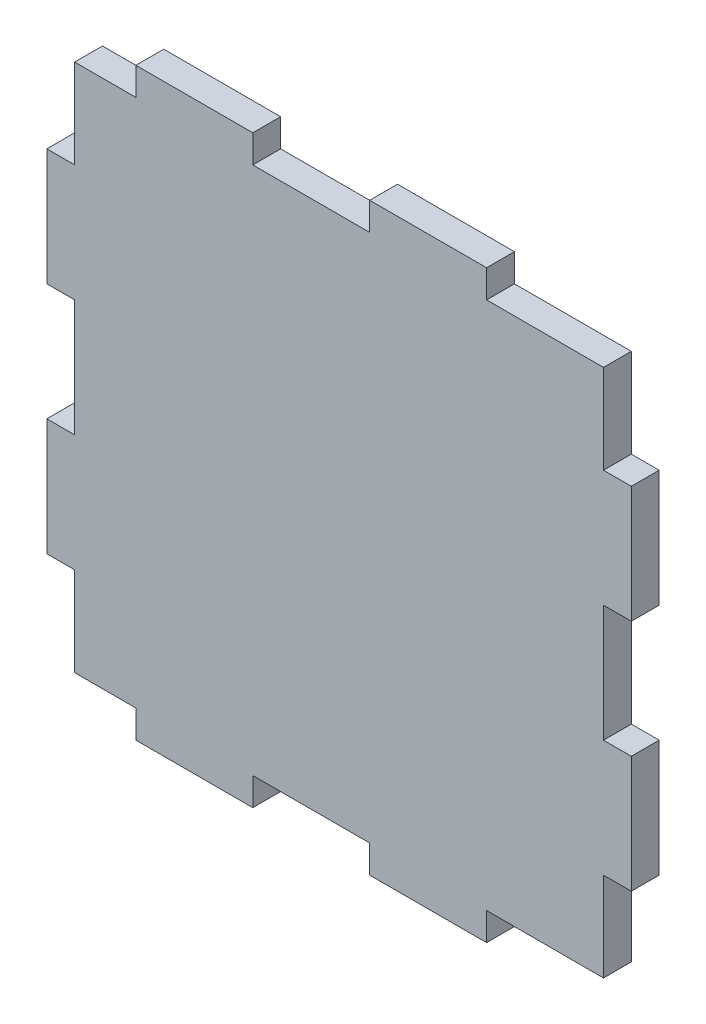
ISO-10303-21;
HEADER;
FILE_DESCRIPTION(('STEP AP214'),'2;1');
FILE_NAME('part.step','',(''),(''),'','','');
FILE_SCHEMA(('AUTOMOTIVE_DESIGN { 1 0 10303 214 1 1 1 1 }'));
ENDSEC;
DATA;
#1=APPLICATION_CONTEXT('core data for automotive mechanical design processes');
#2=APPLICATION_PROTOCOL_DEFINITION('international standard','automotive_design',2000,#1);
#3=PRODUCT_CONTEXT('',#1,'mechanical');
#4=PRODUCT('Part','Part','',(#3));
#5=PRODUCT_RELATED_PRODUCT_CATEGORY('part','',(#4));
#6=PRODUCT_DEFINITION_FORMATION('','',#4);
#7=PRODUCT_DEFINITION_CONTEXT('part definition',#1,'design');
#8=PRODUCT_DEFINITION('design','',#6,#7);
#9=PRODUCT_DEFINITION_SHAPE('','',#8);
#10=(LENGTH_UNIT() NAMED_UNIT(*) SI_UNIT(.MILLI.,.METRE.));
#11=(NAMED_UNIT(*) PLANE_ANGLE_UNIT() SI_UNIT($,.RADIAN.));
#12=(NAMED_UNIT(*) SI_UNIT($,.STERADIAN.) SOLID_ANGLE_UNIT());
#13=UNCERTAINTY_MEASURE_WITH_UNIT(LENGTH_MEASURE(1.E-05),#10,'distance_accuracy_value','');
#14=(GEOMETRIC_REPRESENTATION_CONTEXT(3) GLOBAL_UNCERTAINTY_ASSIGNED_CONTEXT((#13)) GLOBAL_UNIT_ASSIGNED_CONTEXT((#10,
#11,#12)) REPRESENTATION_CONTEXT('',''));
#15=CARTESIAN_POINT('',(0.,0.,0.));
#16=DIRECTION('',(0.,0.,1.));
#17=DIRECTION('',(1.,0.,0.));
#18=AXIS2_PLACEMENT_3D('',#15,#16,#17);
#19=CARTESIAN_POINT('',(50.,0.,0.));
#20=DIRECTION('',(1.,0.,0.));
#21=DIRECTION('',(0.,0.,-1.));
#22=AXIS2_PLACEMENT_3D('',#19,#20,#21);
#23=PLANE('',#22);
#24=DIRECTION('',(0.,1.,0.));
#25=VECTOR('',#24,1.);
#26=CARTESIAN_POINT('',(50.,0.,0.));
#27=LINE('',#26,#25);
#28=CARTESIAN_POINT('',(50.,60.,-2.08166817117217E-13));
#29=VERTEX_POINT('',#28);
#30=CARTESIAN_POINT('',(50.,80.,-2.08166817117217E-13));
#31=VERTEX_POINT('',#30);
#32=EDGE_CURVE('E456',#29,#31,#27,.T.);
#33=ORIENTED_EDGE('',*,*,#32,.T.);
#34=DIRECTION('',(0.,0.,-1.));
#35=VECTOR('',#34,1.);
#36=CARTESIAN_POINT('',(50.,80.,4.7624999999998));
#37=LINE('',#36,#35);
#38=CARTESIAN_POINT('',(50.,80.,4.7624999999998));
#39=VERTEX_POINT('',#38);
#40=EDGE_CURVE('E272',#39,#31,#37,.T.);
#41=ORIENTED_EDGE('',*,*,#40,.F.);
#42=DIRECTION('',(0.,1.,0.));
#43=VECTOR('',#42,1.);
#44=CARTESIAN_POINT('',(50.,0.,4.7625));
#45=LINE('',#44,#43);
#46=CARTESIAN_POINT('',(50.,60.,4.7624999999998));
#47=VERTEX_POINT('',#46);
#48=EDGE_CURVE('E470',#47,#39,#45,.T.);
#49=ORIENTED_EDGE('',*,*,#48,.F.);
#50=DIRECTION('',(0.,0.,1.));
#51=VECTOR('',#50,1.);
#52=CARTESIAN_POINT('',(50.,60.,-2.08166817117217E-13));
#53=LINE('',#52,#51);
#54=EDGE_CURVE('E402',#29,#47,#53,.T.);
#55=ORIENTED_EDGE('',*,*,#54,.F.);
#56=EDGE_LOOP('',(#33,#41,#49,#55));
#57=FACE_BOUND('',#56,.T.);
#58=ADVANCED_FACE('F33',(#57),#23,.T.);
#59=CARTESIAN_POINT('',(50.,20.,0.));
#60=VERTEX_POINT('',#59);
#61=CARTESIAN_POINT('',(50.,40.,0.));
#62=VERTEX_POINT('',#61);
#63=EDGE_CURVE('E459',#60,#62,#27,.T.);
#64=ORIENTED_EDGE('',*,*,#63,.T.);
#65=DIRECTION('',(0.,0.,-1.));
#66=VECTOR('',#65,1.);
#67=CARTESIAN_POINT('',(50.,40.,4.76249999999993));
#68=LINE('',#67,#66);
#69=CARTESIAN_POINT('',(50.,40.,4.76249999999993));
#70=VERTEX_POINT('',#69);
#71=EDGE_CURVE('E404',#70,#62,#68,.T.);
#72=ORIENTED_EDGE('',*,*,#71,.F.);
#73=CARTESIAN_POINT('',(50.,20.,4.76249999999993));
#74=VERTEX_POINT('',#73);
#75=EDGE_CURVE('E473',#74,#70,#45,.T.);
#76=ORIENTED_EDGE('',*,*,#75,.F.);
#77=DIRECTION('',(0.,0.,1.));
#78=VECTOR('',#77,1.);
#79=CARTESIAN_POINT('',(50.,20.,0.));
#80=LINE('',#79,#78);
#81=EDGE_CURVE('E406',#60,#74,#80,.T.);
#82=ORIENTED_EDGE('',*,*,#81,.F.);
#83=EDGE_LOOP('',(#64,#72,#76,#82));
#84=FACE_BOUND('',#83,.T.);
#85=ADVANCED_FACE('F525',(#84),#23,.T.);
#86=CARTESIAN_POINT('',(50.,0.,0.));
#87=DIRECTION('',(0.,-1.,0.));
#88=DIRECTION('',(0.,0.,-1.));
#89=AXIS2_PLACEMENT_3D('',#86,#87,#88);
#90=PLANE('',#89);
#91=DIRECTION('',(0.,0.,1.));
#92=VECTOR('',#91,1.);
#93=CARTESIAN_POINT('',(25.2375,0.,-45.2375));
#94=LINE('',#93,#92);
#95=CARTESIAN_POINT('',(25.2375,0.,0.));
#96=VERTEX_POINT('',#95);
#97=CARTESIAN_POINT('',(25.2375,0.,4.7625));
#98=VERTEX_POINT('',#97);
#99=EDGE_CURVE('E639',#96,#98,#94,.T.);
#100=ORIENTED_EDGE('',*,*,#99,.T.);
#101=DIRECTION('',(1.,0.,0.));
#102=VECTOR('',#101,1.);
#103=CARTESIAN_POINT('',(50.,0.,4.7625));
#104=LINE('',#103,#102);
#105=CARTESIAN_POINT('',(5.2375,0.,4.7625));
#106=VERTEX_POINT('',#105);
#107=EDGE_CURVE('E36',#106,#98,#104,.T.);
#108=ORIENTED_EDGE('',*,*,#107,.F.);
#109=DIRECTION('',(0.,0.,1.));
#110=VECTOR('',#109,1.);
#111=CARTESIAN_POINT('',(5.23750000000003,0.,-45.2375));
#112=LINE('',#111,#110);
#113=CARTESIAN_POINT('',(5.2375,0.,0.));
#114=VERTEX_POINT('',#113);
#115=EDGE_CURVE('E645',#114,#106,#112,.T.);
#116=ORIENTED_EDGE('',*,*,#115,.F.);
#117=DIRECTION('',(1.,0.,0.));
#118=VECTOR('',#117,1.);
#119=CARTESIAN_POINT('',(50.,0.,0.));
#120=LINE('',#119,#118);
#121=EDGE_CURVE('E41',#114,#96,#120,.T.);
#122=ORIENTED_EDGE('',*,*,#121,.T.);
#123=EDGE_LOOP('',(#100,#108,#116,#122));
#124=FACE_BOUND('',#123,.T.);
#125=ADVANCED_FACE('F531',(#124),#90,.T.);
#126=DIRECTION('',(0.,0.,1.));
#127=VECTOR('',#126,1.);
#128=CARTESIAN_POINT('',(-14.7625,0.,-45.2375));
#129=LINE('',#128,#127);
#130=CARTESIAN_POINT('',(-14.7625,0.,0.));
#131=VERTEX_POINT('',#130);
#132=CARTESIAN_POINT('',(-14.7625,0.,4.7625));
#133=VERTEX_POINT('',#132);
#134=EDGE_CURVE('E625',#131,#133,#129,.T.);
#135=ORIENTED_EDGE('',*,*,#134,.T.);
#136=CARTESIAN_POINT('',(-34.7625,0.,4.7625));
#137=VERTEX_POINT('',#136);
#138=EDGE_CURVE('E460',#137,#133,#104,.T.);
#139=ORIENTED_EDGE('',*,*,#138,.F.);
#140=DIRECTION('',(0.,0.,1.));
#141=VECTOR('',#140,1.);
#142=CARTESIAN_POINT('',(-34.7625,0.,-45.2375));
#143=LINE('',#142,#141);
#144=CARTESIAN_POINT('',(-34.7625,0.,0.));
#145=VERTEX_POINT('',#144);
#146=EDGE_CURVE('E616',#145,#137,#143,.T.);
#147=ORIENTED_EDGE('',*,*,#146,.F.);
#148=EDGE_CURVE('E11',#145,#131,#120,.T.);
#149=ORIENTED_EDGE('',*,*,#148,.T.);
#150=EDGE_LOOP('',(#135,#139,#147,#149));
#151=FACE_BOUND('',#150,.T.);
#152=ADVANCED_FACE('F578',(#151),#90,.T.);
#153=CARTESIAN_POINT('',(-50.,0.,0.));
#154=DIRECTION('',(-1.,0.,0.));
#155=DIRECTION('',(0.,0.,1.));
#156=AXIS2_PLACEMENT_3D('',#153,#154,#155);
#157=PLANE('',#156);
#158=DIRECTION('',(0.,0.,-1.));
#159=VECTOR('',#158,1.);
#160=CARTESIAN_POINT('',(-50.,60.,4.7624999999998));
#161=LINE('',#160,#159);
#162=CARTESIAN_POINT('',(-50.,60.,4.7624999999998));
#163=VERTEX_POINT('',#162);
#164=CARTESIAN_POINT('',(-50.,60.,-2.08166817117217E-13));
#165=VERTEX_POINT('',#164);
#166=EDGE_CURVE('E319',#163,#165,#161,.T.);
#167=ORIENTED_EDGE('',*,*,#166,.F.);
#168=DIRECTION('',(0.,-1.,0.));
#169=VECTOR('',#168,1.);
#170=CARTESIAN_POINT('',(-50.,0.,4.7625));
#171=LINE('',#170,#169);
#172=CARTESIAN_POINT('',(-50.,80.,4.7625));
#173=VERTEX_POINT('',#172);
#174=EDGE_CURVE('E479',#173,#163,#171,.T.);
#175=ORIENTED_EDGE('',*,*,#174,.F.);
#176=DIRECTION('',(0.,0.,-1.));
#177=VECTOR('',#176,1.);
#178=CARTESIAN_POINT('',(-50.,80.,4.7624999999998));
#179=LINE('',#178,#177);
#180=CARTESIAN_POINT('',(-50.,80.,-2.08166817117217E-13));
#181=VERTEX_POINT('',#180);
#182=EDGE_CURVE('E316',#173,#181,#179,.T.);
#183=ORIENTED_EDGE('',*,*,#182,.T.);
#184=DIRECTION('',(0.,-1.,0.));
#185=VECTOR('',#184,1.);
#186=CARTESIAN_POINT('',(-50.,0.,0.));
#187=LINE('',#186,#185);
#188=EDGE_CURVE('E467',#181,#165,#187,.T.);
#189=ORIENTED_EDGE('',*,*,#188,.T.);
#190=EDGE_LOOP('',(#167,#175,#183,#189));
#191=FACE_BOUND('',#190,.T.);
#192=ADVANCED_FACE('F580',(#191),#157,.T.);
#193=DIRECTION('',(0.,0.,-1.));
#194=VECTOR('',#193,1.);
#195=CARTESIAN_POINT('',(-50.,20.,4.76249999999993));
#196=LINE('',#195,#194);
#197=CARTESIAN_POINT('',(-50.,20.,4.76249999999993));
#198=VERTEX_POINT('',#197);
#199=CARTESIAN_POINT('',(-50.,20.,0.));
#200=VERTEX_POINT('',#199);
#201=EDGE_CURVE('E339',#198,#200,#196,.T.);
#202=ORIENTED_EDGE('',*,*,#201,.F.);
#203=CARTESIAN_POINT('',(-50.,40.,4.7625));
#204=VERTEX_POINT('',#203);
#205=EDGE_CURVE('E477',#204,#198,#171,.T.);
#206=ORIENTED_EDGE('',*,*,#205,.F.);
#207=DIRECTION('',(0.,0.,-1.));
#208=VECTOR('',#207,1.);
#209=CARTESIAN_POINT('',(-50.,40.,4.76249999999993));
#210=LINE('',#209,#208);
#211=CARTESIAN_POINT('',(-50.,40.,0.));
#212=VERTEX_POINT('',#211);
#213=EDGE_CURVE('E336',#204,#212,#210,.T.);
#214=ORIENTED_EDGE('',*,*,#213,.T.);
#215=EDGE_CURVE('E465',#212,#200,#187,.T.);
#216=ORIENTED_EDGE('',*,*,#215,.T.);
#217=EDGE_LOOP('',(#202,#206,#214,#216));
#218=FACE_BOUND('',#217,.T.);
#219=ADVANCED_FACE('F582',(#218),#157,.T.);
#220=CARTESIAN_POINT('',(50.,100.,0.));
#221=DIRECTION('',(0.,1.,0.));
#222=DIRECTION('',(0.,0.,1.));
#223=AXIS2_PLACEMENT_3D('',#220,#221,#222);
#224=PLANE('',#223);
#225=DIRECTION('',(0.,0.,1.));
#226=VECTOR('',#225,1.);
#227=CARTESIAN_POINT('',(25.2375,100.,0.));
#228=LINE('',#227,#226);
#229=CARTESIAN_POINT('',(25.2375,100.,0.));
#230=VERTEX_POINT('',#229);
#231=CARTESIAN_POINT('',(25.2375,100.,4.7625));
#232=VERTEX_POINT('',#231);
#233=EDGE_CURVE('E353',#230,#232,#228,.T.);
#234=ORIENTED_EDGE('',*,*,#233,.F.);
#235=DIRECTION('',(-1.,0.,0.));
#236=VECTOR('',#235,1.);
#237=CARTESIAN_POINT('',(50.,100.,0.));
#238=LINE('',#237,#236);
#239=CARTESIAN_POINT('',(5.2375,100.,0.));
#240=VERTEX_POINT('',#239);
#241=EDGE_CURVE('E464',#230,#240,#238,.T.);
#242=ORIENTED_EDGE('',*,*,#241,.T.);
#243=DIRECTION('',(0.,0.,-1.));
#244=VECTOR('',#243,1.);
#245=CARTESIAN_POINT('',(5.23749999999999,100.,4.76249999999999));
#246=LINE('',#245,#244);
#247=CARTESIAN_POINT('',(5.23749999999999,100.,4.76249999999999));
#248=VERTEX_POINT('',#247);
#249=EDGE_CURVE('E378',#248,#240,#246,.T.);
#250=ORIENTED_EDGE('',*,*,#249,.F.);
#251=DIRECTION('',(-1.,0.,0.));
#252=VECTOR('',#251,1.);
#253=CARTESIAN_POINT('',(50.,100.,4.7625));
#254=LINE('',#253,#252);
#255=EDGE_CURVE('E476',#232,#248,#254,.T.);
#256=ORIENTED_EDGE('',*,*,#255,.F.);
#257=EDGE_LOOP('',(#234,#242,#250,#256));
#258=FACE_BOUND('',#257,.T.);
#259=ADVANCED_FACE('F491',(#258),#224,.T.);
#260=CARTESIAN_POINT('',(0.,0.,4.7625));
#261=DIRECTION('',(0.,0.,1.));
#262=DIRECTION('',(1.,0.,0.));
#263=AXIS2_PLACEMENT_3D('',#260,#261,#262);
#264=PLANE('',#263);
#265=DIRECTION('',(0.,-1.,0.));
#266=VECTOR('',#265,1.);
#267=CARTESIAN_POINT('',(45.2375,60.,4.7624999999998));
#268=LINE('',#267,#266);
#269=CARTESIAN_POINT('',(45.2375,60.,4.7624999999998));
#270=VERTEX_POINT('',#269);
#271=CARTESIAN_POINT('',(45.2375,40.,4.7625));
#272=VERTEX_POINT('',#271);
#273=EDGE_CURVE('E414',#270,#272,#268,.T.);
#274=ORIENTED_EDGE('',*,*,#273,.F.);
#275=DIRECTION('',(-1.,0.,0.));
#276=VECTOR('',#275,1.);
#277=CARTESIAN_POINT('',(50.,60.,4.7624999999998));
#278=LINE('',#277,#276);
#279=EDGE_CURVE('E427',#47,#270,#278,.T.);
#280=ORIENTED_EDGE('',*,*,#279,.F.);
#281=ORIENTED_EDGE('',*,*,#48,.T.);
#282=DIRECTION('',(-1.,0.,0.));
#283=VECTOR('',#282,1.);
#284=CARTESIAN_POINT('',(50.,80.,4.7624999999998));
#285=LINE('',#284,#283);
#286=CARTESIAN_POINT('',(45.2375,80.,4.7624999999998));
#287=VERTEX_POINT('',#286);
#288=EDGE_CURVE('E436',#39,#287,#285,.T.);
#289=ORIENTED_EDGE('',*,*,#288,.T.);
#290=DIRECTION('',(0.,-1.,0.));
#291=VECTOR('',#290,1.);
#292=CARTESIAN_POINT('',(45.2375,100.,4.7625));
#293=LINE('',#292,#291);
#294=CARTESIAN_POINT('',(45.2375,95.2375,4.76249999999995));
#295=VERTEX_POINT('',#294);
#296=EDGE_CURVE('E384',#295,#287,#293,.T.);
#297=ORIENTED_EDGE('',*,*,#296,.F.);
#298=DIRECTION('',(1.,0.,0.));
#299=VECTOR('',#298,1.);
#300=CARTESIAN_POINT('',(25.2375,95.2375,4.76249999999999));
#301=LINE('',#300,#299);
#302=CARTESIAN_POINT('',(25.2375,95.2375,4.76249999999999));
#303=VERTEX_POINT('',#302);
#304=EDGE_CURVE('E371',#303,#295,#301,.T.);
#305=ORIENTED_EDGE('',*,*,#304,.F.);
#306=DIRECTION('',(0.,1.,0.));
#307=VECTOR('',#306,1.);
#308=CARTESIAN_POINT('',(25.2375,95.2375,4.76249999999999));
#309=LINE('',#308,#307);
#310=EDGE_CURVE('E381',#303,#232,#309,.T.);
#311=ORIENTED_EDGE('',*,*,#310,.T.);
#312=ORIENTED_EDGE('',*,*,#255,.T.);
#313=DIRECTION('',(0.,1.,0.));
#314=VECTOR('',#313,1.);
#315=CARTESIAN_POINT('',(5.23749999999999,95.2375,4.76249999999999));
#316=LINE('',#315,#314);
#317=CARTESIAN_POINT('',(5.23749999999999,95.2375,4.76249999999999));
#318=VERTEX_POINT('',#317);
#319=EDGE_CURVE('E390',#318,#248,#316,.T.);
#320=ORIENTED_EDGE('',*,*,#319,.F.);
#321=DIRECTION('',(1.,0.,0.));
#322=VECTOR('',#321,1.);
#323=CARTESIAN_POINT('',(-14.7625,95.2375,4.76249999999999));
#324=LINE('',#323,#322);
#325=CARTESIAN_POINT('',(-14.7625,95.2375,4.76249999999999));
#326=VERTEX_POINT('',#325);
#327=EDGE_CURVE('E362',#326,#318,#324,.T.);
#328=ORIENTED_EDGE('',*,*,#327,.F.);
#329=DIRECTION('',(0.,1.,0.));
#330=VECTOR('',#329,1.);
#331=CARTESIAN_POINT('',(-14.7625,95.2375,4.76249999999999));
#332=LINE('',#331,#330);
#333=CARTESIAN_POINT('',(-14.7625,100.,4.7625));
#334=VERTEX_POINT('',#333);
#335=EDGE_CURVE('E392',#326,#334,#332,.T.);
#336=ORIENTED_EDGE('',*,*,#335,.T.);
#337=CARTESIAN_POINT('',(-34.7625,100.,4.76249999999999));
#338=VERTEX_POINT('',#337);
#339=EDGE_CURVE('E474',#334,#338,#254,.T.);
#340=ORIENTED_EDGE('',*,*,#339,.T.);
#341=DIRECTION('',(0.,1.,0.));
#342=VECTOR('',#341,1.);
#343=CARTESIAN_POINT('',(-34.7625,95.2375,4.76249999999999));
#344=LINE('',#343,#342);
#345=CARTESIAN_POINT('',(-34.7625,95.2375,4.76249999999999));
#346=VERTEX_POINT('',#345);
#347=EDGE_CURVE('E374',#346,#338,#344,.T.);
#348=ORIENTED_EDGE('',*,*,#347,.F.);
#349=DIRECTION('',(1.,0.,0.));
#350=VECTOR('',#349,1.);
#351=CARTESIAN_POINT('',(-45.2375,95.2375,4.76249999999999));
#352=LINE('',#351,#350);
#353=CARTESIAN_POINT('',(-45.2375,95.2375,4.7625));
#354=VERTEX_POINT('',#353);
#355=EDGE_CURVE('E352',#354,#346,#352,.T.);
#356=ORIENTED_EDGE('',*,*,#355,.F.);
#357=DIRECTION('',(0.,1.,0.));
#358=VECTOR('',#357,1.);
#359=CARTESIAN_POINT('',(-45.2375,0.,4.7625));
#360=LINE('',#359,#358);
#361=CARTESIAN_POINT('',(-45.2375,80.,4.7624999999998));
#362=VERTEX_POINT('',#361);
#363=EDGE_CURVE('E342',#362,#354,#360,.T.);
#364=ORIENTED_EDGE('',*,*,#363,.F.);
#365=DIRECTION('',(-1.,0.,0.));
#366=VECTOR('',#365,1.);
#367=CARTESIAN_POINT('',(-45.2375,80.,4.7624999999998));
#368=LINE('',#367,#366);
#369=EDGE_CURVE('E310',#362,#173,#368,.T.);
#370=ORIENTED_EDGE('',*,*,#369,.T.);
#371=ORIENTED_EDGE('',*,*,#174,.T.);
#372=DIRECTION('',(-1.,0.,0.));
#373=VECTOR('',#372,1.);
#374=CARTESIAN_POINT('',(-45.2375,60.,4.7624999999998));
#375=LINE('',#374,#373);
#376=CARTESIAN_POINT('',(-45.2375,60.,4.7624999999998));
#377=VERTEX_POINT('',#376);
#378=EDGE_CURVE('E313',#377,#163,#375,.T.);
#379=ORIENTED_EDGE('',*,*,#378,.F.);
#380=CARTESIAN_POINT('',(-45.2375,40.,4.76249999999993));
#381=VERTEX_POINT('',#380);
#382=EDGE_CURVE('E349',#381,#377,#360,.T.);
#383=ORIENTED_EDGE('',*,*,#382,.F.);
#384=DIRECTION('',(-1.,0.,0.));
#385=VECTOR('',#384,1.);
#386=CARTESIAN_POINT('',(-45.2375,40.,4.76249999999993));
#387=LINE('',#386,#385);
#388=EDGE_CURVE('E330',#381,#204,#387,.T.);
#389=ORIENTED_EDGE('',*,*,#388,.T.);
#390=ORIENTED_EDGE('',*,*,#205,.T.);
#391=DIRECTION('',(-1.,0.,0.));
#392=VECTOR('',#391,1.);
#393=CARTESIAN_POINT('',(-45.2375,20.,4.76249999999993));
#394=LINE('',#393,#392);
#395=CARTESIAN_POINT('',(-45.2375,20.,4.76249999999993));
#396=VERTEX_POINT('',#395);
#397=EDGE_CURVE('E333',#396,#198,#394,.T.);
#398=ORIENTED_EDGE('',*,*,#397,.F.);
#399=CARTESIAN_POINT('',(-45.2375,4.7625,4.7625));
#400=VERTEX_POINT('',#399);
#401=EDGE_CURVE('E346',#400,#396,#360,.T.);
#402=ORIENTED_EDGE('',*,*,#401,.F.);
#403=DIRECTION('',(1.,0.,0.));
#404=VECTOR('',#403,1.);
#405=CARTESIAN_POINT('',(-50.,4.7625,4.7625));
#406=LINE('',#405,#404);
#407=CARTESIAN_POINT('',(-34.7625,4.7625,4.7625));
#408=VERTEX_POINT('',#407);
#409=EDGE_CURVE('E291',#400,#408,#406,.T.);
#410=ORIENTED_EDGE('',*,*,#409,.T.);
#411=DIRECTION('',(0.,1.,0.));
#412=VECTOR('',#411,1.);
#413=CARTESIAN_POINT('',(-34.7625,0.,4.7625));
#414=LINE('',#413,#412);
#415=EDGE_CURVE('E614',#137,#408,#414,.T.);
#416=ORIENTED_EDGE('',*,*,#415,.F.);
#417=ORIENTED_EDGE('',*,*,#138,.T.);
#418=DIRECTION('',(0.,1.,0.));
#419=VECTOR('',#418,1.);
#420=CARTESIAN_POINT('',(-14.7625,0.,4.7625));
#421=LINE('',#420,#419);
#422=CARTESIAN_POINT('',(-14.7625,4.7625,4.7625));
#423=VERTEX_POINT('',#422);
#424=EDGE_CURVE('E619',#133,#423,#421,.T.);
#425=ORIENTED_EDGE('',*,*,#424,.T.);
#426=CARTESIAN_POINT('',(5.2375,4.7625,4.7625));
#427=VERTEX_POINT('',#426);
#428=EDGE_CURVE('E288',#423,#427,#406,.T.);
#429=ORIENTED_EDGE('',*,*,#428,.T.);
#430=DIRECTION('',(0.,1.,0.));
#431=VECTOR('',#430,1.);
#432=CARTESIAN_POINT('',(5.2375,0.,4.7625));
#433=LINE('',#432,#431);
#434=EDGE_CURVE('E638',#106,#427,#433,.T.);
#435=ORIENTED_EDGE('',*,*,#434,.F.);
#436=ORIENTED_EDGE('',*,*,#107,.T.);
#437=DIRECTION('',(0.,1.,0.));
#438=VECTOR('',#437,1.);
#439=CARTESIAN_POINT('',(25.2375,0.,4.7625));
#440=LINE('',#439,#438);
#441=CARTESIAN_POINT('',(25.2375,4.7625,4.7625));
#442=VERTEX_POINT('',#441);
#443=EDGE_CURVE('E287',#98,#442,#440,.T.);
#444=ORIENTED_EDGE('',*,*,#443,.T.);
#445=CARTESIAN_POINT('',(45.2375,4.7625,4.7625));
#446=VERTEX_POINT('',#445);
#447=EDGE_CURVE('E57',#442,#446,#406,.T.);
#448=ORIENTED_EDGE('',*,*,#447,.T.);
#449=DIRECTION('',(0.,-1.,0.));
#450=VECTOR('',#449,1.);
#451=CARTESIAN_POINT('',(45.2375,20.,4.76249999999993));
#452=LINE('',#451,#450);
#453=CARTESIAN_POINT('',(45.2375,20.,4.76249999999993));
#454=VERTEX_POINT('',#453);
#455=EDGE_CURVE('E273',#454,#446,#452,.T.);
#456=ORIENTED_EDGE('',*,*,#455,.F.);
#457=DIRECTION('',(-1.,0.,0.));
#458=VECTOR('',#457,1.);
#459=CARTESIAN_POINT('',(50.,20.,4.76249999999993));
#460=LINE('',#459,#458);
#461=EDGE_CURVE('E408',#74,#454,#460,.T.);
#462=ORIENTED_EDGE('',*,*,#461,.F.);
#463=ORIENTED_EDGE('',*,*,#75,.T.);
#464=DIRECTION('',(-1.,0.,0.));
#465=VECTOR('',#464,1.);
#466=CARTESIAN_POINT('',(50.,40.,4.76249999999993));
#467=LINE('',#466,#465);
#468=EDGE_CURVE('E424',#70,#272,#467,.T.);
#469=ORIENTED_EDGE('',*,*,#468,.T.);
#470=EDGE_LOOP('',(#274,#280,#281,#289,#297,#305,#311,#312,#320,#328,#336,#340,#348,#356,#364,
#370,#371,#379,#383,#389,#390,#398,#402,#410,#416,#417,#425,#429,#435,#436,#444,#448,#456,#462,
#463,#469));
#471=FACE_BOUND('',#470,.T.);
#472=ADVANCED_FACE('F285',(#471),#264,.T.);
#473=DIRECTION('',(0.,0.,1.));
#474=VECTOR('',#473,1.);
#475=CARTESIAN_POINT('',(-14.7625,100.,0.));
#476=LINE('',#475,#474);
#477=CARTESIAN_POINT('',(-14.7625,100.,0.));
#478=VERTEX_POINT('',#477);
#479=EDGE_CURVE('E376',#478,#334,#476,.T.);
#480=ORIENTED_EDGE('',*,*,#479,.F.);
#481=CARTESIAN_POINT('',(-34.7625,100.,0.));
#482=VERTEX_POINT('',#481);
#483=EDGE_CURVE('E461',#478,#482,#238,.T.);
#484=ORIENTED_EDGE('',*,*,#483,.T.);
#485=DIRECTION('',(0.,0.,-1.));
#486=VECTOR('',#485,1.);
#487=CARTESIAN_POINT('',(-34.7625,100.,4.76249999999999));
#488=LINE('',#487,#486);
#489=EDGE_CURVE('E348',#338,#482,#488,.T.);
#490=ORIENTED_EDGE('',*,*,#489,.F.);
#491=ORIENTED_EDGE('',*,*,#339,.F.);
#492=EDGE_LOOP('',(#480,#484,#490,#491));
#493=FACE_BOUND('',#492,.T.);
#494=ADVANCED_FACE('F573',(#493),#224,.T.);
#495=CARTESIAN_POINT('',(0.,0.,0.));
#496=DIRECTION('',(0.,0.,1.));
#497=DIRECTION('',(1.,0.,0.));
#498=AXIS2_PLACEMENT_3D('',#495,#496,#497);
#499=PLANE('',#498);
#500=DIRECTION('',(0.,1.,0.));
#501=VECTOR('',#500,1.);
#502=CARTESIAN_POINT('',(-34.7625,0.,0.));
#503=LINE('',#502,#501);
#504=CARTESIAN_POINT('',(-34.7625,4.7625,0.));
#505=VERTEX_POINT('',#504);
#506=EDGE_CURVE('E620',#145,#505,#503,.T.);
#507=ORIENTED_EDGE('',*,*,#506,.T.);
#508=DIRECTION('',(1.,0.,0.));
#509=VECTOR('',#508,1.);
#510=CARTESIAN_POINT('',(0.,4.7625,0.));
#511=LINE('',#510,#509);
#512=CARTESIAN_POINT('',(-45.2375,4.7625,0.));
#513=VERTEX_POINT('',#512);
#514=EDGE_CURVE('E451',#513,#505,#511,.T.);
#515=ORIENTED_EDGE('',*,*,#514,.F.);
#516=DIRECTION('',(0.,-1.,0.));
#517=VECTOR('',#516,1.);
#518=CARTESIAN_POINT('',(-45.2375,0.,0.));
#519=LINE('',#518,#517);
#520=CARTESIAN_POINT('',(-45.2375,20.,0.));
#521=VERTEX_POINT('',#520);
#522=EDGE_CURVE('E441',#521,#513,#519,.T.);
#523=ORIENTED_EDGE('',*,*,#522,.F.);
#524=DIRECTION('',(-1.,0.,0.));
#525=VECTOR('',#524,1.);
#526=CARTESIAN_POINT('',(-45.2375,20.,0.));
#527=LINE('',#526,#525);
#528=EDGE_CURVE('E322',#521,#200,#527,.T.);
#529=ORIENTED_EDGE('',*,*,#528,.T.);
#530=ORIENTED_EDGE('',*,*,#215,.F.);
#531=DIRECTION('',(-1.,0.,0.));
#532=VECTOR('',#531,1.);
#533=CARTESIAN_POINT('',(-45.2375,40.,0.));
#534=LINE('',#533,#532);
#535=CARTESIAN_POINT('',(-45.2375,40.,0.));
#536=VERTEX_POINT('',#535);
#537=EDGE_CURVE('E328',#536,#212,#534,.T.);
#538=ORIENTED_EDGE('',*,*,#537,.F.);
#539=CARTESIAN_POINT('',(-45.2375,60.,-2.08166817117217E-13));
#540=VERTEX_POINT('',#539);
#541=EDGE_CURVE('E443',#540,#536,#519,.T.);
#542=ORIENTED_EDGE('',*,*,#541,.F.);
#543=DIRECTION('',(-1.,0.,0.));
#544=VECTOR('',#543,1.);
#545=CARTESIAN_POINT('',(-45.2375,60.,-2.08166817117217E-13));
#546=LINE('',#545,#544);
#547=EDGE_CURVE('E302',#540,#165,#546,.T.);
#548=ORIENTED_EDGE('',*,*,#547,.T.);
#549=ORIENTED_EDGE('',*,*,#188,.F.);
#550=DIRECTION('',(-1.,0.,0.));
#551=VECTOR('',#550,1.);
#552=CARTESIAN_POINT('',(-45.2375,80.,-2.08166817117217E-13));
#553=LINE('',#552,#551);
#554=CARTESIAN_POINT('',(-45.2375,80.,-2.08166817117217E-13));
#555=VERTEX_POINT('',#554);
#556=EDGE_CURVE('E306',#555,#181,#553,.T.);
#557=ORIENTED_EDGE('',*,*,#556,.F.);
#558=CARTESIAN_POINT('',(-45.2375,95.2375,0.));
#559=VERTEX_POINT('',#558);
#560=EDGE_CURVE('E444',#559,#555,#519,.T.);
#561=ORIENTED_EDGE('',*,*,#560,.F.);
#562=DIRECTION('',(-1.,0.,0.));
#563=VECTOR('',#562,1.);
#564=CARTESIAN_POINT('',(0.,95.2375,0.));
#565=LINE('',#564,#563);
#566=CARTESIAN_POINT('',(-34.7625,95.2375,0.));
#567=VERTEX_POINT('',#566);
#568=EDGE_CURVE('E445',#567,#559,#565,.T.);
#569=ORIENTED_EDGE('',*,*,#568,.F.);
#570=DIRECTION('',(0.,1.,0.));
#571=VECTOR('',#570,1.);
#572=CARTESIAN_POINT('',(-34.7625,95.2375,0.));
#573=LINE('',#572,#571);
#574=EDGE_CURVE('E397',#567,#482,#573,.T.);
#575=ORIENTED_EDGE('',*,*,#574,.T.);
#576=ORIENTED_EDGE('',*,*,#483,.F.);
#577=DIRECTION('',(0.,1.,0.));
#578=VECTOR('',#577,1.);
#579=CARTESIAN_POINT('',(-14.7625,95.2375,0.));
#580=LINE('',#579,#578);
#581=CARTESIAN_POINT('',(-14.7625,95.2375,0.));
#582=VERTEX_POINT('',#581);
#583=EDGE_CURVE('E395',#582,#478,#580,.T.);
#584=ORIENTED_EDGE('',*,*,#583,.F.);
#585=CARTESIAN_POINT('',(5.2375,95.2375,0.));
#586=VERTEX_POINT('',#585);
#587=EDGE_CURVE('E447',#586,#582,#565,.T.);
#588=ORIENTED_EDGE('',*,*,#587,.F.);
#589=DIRECTION('',(0.,1.,0.));
#590=VECTOR('',#589,1.);
#591=CARTESIAN_POINT('',(5.2375,95.2375,0.));
#592=LINE('',#591,#590);
#593=EDGE_CURVE('E387',#586,#240,#592,.T.);
#594=ORIENTED_EDGE('',*,*,#593,.T.);
#595=ORIENTED_EDGE('',*,*,#241,.F.);
#596=DIRECTION('',(0.,1.,0.));
#597=VECTOR('',#596,1.);
#598=CARTESIAN_POINT('',(25.2375,95.2375,0.));
#599=LINE('',#598,#597);
#600=CARTESIAN_POINT('',(25.2375,95.2375,0.));
#601=VERTEX_POINT('',#600);
#602=EDGE_CURVE('E385',#601,#230,#599,.T.);
#603=ORIENTED_EDGE('',*,*,#602,.F.);
#604=CARTESIAN_POINT('',(45.2375,95.2375,0.));
#605=VERTEX_POINT('',#604);
#606=EDGE_CURVE('E448',#605,#601,#565,.T.);
#607=ORIENTED_EDGE('',*,*,#606,.F.);
#608=DIRECTION('',(0.,1.,0.));
#609=VECTOR('',#608,1.);
#610=CARTESIAN_POINT('',(45.2375,0.,0.));
#611=LINE('',#610,#609);
#612=CARTESIAN_POINT('',(45.2375,80.,-2.08166817117217E-13));
#613=VERTEX_POINT('',#612);
#614=EDGE_CURVE('E452',#613,#605,#611,.T.);
#615=ORIENTED_EDGE('',*,*,#614,.F.);
#616=DIRECTION('',(-1.,0.,0.));
#617=VECTOR('',#616,1.);
#618=CARTESIAN_POINT('',(50.,80.,-2.08166817117217E-13));
#619=LINE('',#618,#617);
#620=EDGE_CURVE('E433',#31,#613,#619,.T.);
#621=ORIENTED_EDGE('',*,*,#620,.F.);
#622=ORIENTED_EDGE('',*,*,#32,.F.);
#623=DIRECTION('',(-1.,0.,0.));
#624=VECTOR('',#623,1.);
#625=CARTESIAN_POINT('',(50.,60.,-2.08166817117217E-13));
#626=LINE('',#625,#624);
#627=CARTESIAN_POINT('',(45.2375,60.,-2.08166817117217E-13));
#628=VERTEX_POINT('',#627);
#629=EDGE_CURVE('E430',#29,#628,#626,.T.);
#630=ORIENTED_EDGE('',*,*,#629,.T.);
#631=CARTESIAN_POINT('',(45.2375,40.,0.));
#632=VERTEX_POINT('',#631);
#633=EDGE_CURVE('E454',#632,#628,#611,.T.);
#634=ORIENTED_EDGE('',*,*,#633,.F.);
#635=DIRECTION('',(-1.,0.,0.));
#636=VECTOR('',#635,1.);
#637=CARTESIAN_POINT('',(50.,40.,0.));
#638=LINE('',#637,#636);
#639=EDGE_CURVE('E422',#62,#632,#638,.T.);
#640=ORIENTED_EDGE('',*,*,#639,.F.);
#641=ORIENTED_EDGE('',*,*,#63,.F.);
#642=DIRECTION('',(-1.,0.,0.));
#643=VECTOR('',#642,1.);
#644=CARTESIAN_POINT('',(50.,20.,0.));
#645=LINE('',#644,#643);
#646=CARTESIAN_POINT('',(45.2375,20.,0.));
#647=VERTEX_POINT('',#646);
#648=EDGE_CURVE('E419',#60,#647,#645,.T.);
#649=ORIENTED_EDGE('',*,*,#648,.T.);
#650=CARTESIAN_POINT('',(45.2375,4.7625,0.));
#651=VERTEX_POINT('',#650);
#652=EDGE_CURVE('E455',#651,#647,#611,.T.);
#653=ORIENTED_EDGE('',*,*,#652,.F.);
#654=CARTESIAN_POINT('',(25.2375,4.7625,0.));
#655=VERTEX_POINT('',#654);
#656=EDGE_CURVE('E269',#655,#651,#511,.T.);
#657=ORIENTED_EDGE('',*,*,#656,.F.);
#658=DIRECTION('',(0.,1.,0.));
#659=VECTOR('',#658,1.);
#660=CARTESIAN_POINT('',(25.2375,0.,0.));
#661=LINE('',#660,#659);
#662=EDGE_CURVE('E289',#96,#655,#661,.T.);
#663=ORIENTED_EDGE('',*,*,#662,.F.);
#664=ORIENTED_EDGE('',*,*,#121,.F.);
#665=DIRECTION('',(0.,1.,0.));
#666=VECTOR('',#665,1.);
#667=CARTESIAN_POINT('',(5.2375,0.,0.));
#668=LINE('',#667,#666);
#669=CARTESIAN_POINT('',(5.2375,4.7625,0.));
#670=VERTEX_POINT('',#669);
#671=EDGE_CURVE('E635',#114,#670,#668,.T.);
#672=ORIENTED_EDGE('',*,*,#671,.T.);
#673=CARTESIAN_POINT('',(-14.7625,4.7625,0.));
#674=VERTEX_POINT('',#673);
#675=EDGE_CURVE('E450',#674,#670,#511,.T.);
#676=ORIENTED_EDGE('',*,*,#675,.F.);
#677=DIRECTION('',(0.,1.,0.));
#678=VECTOR('',#677,1.);
#679=CARTESIAN_POINT('',(-14.7625,0.,0.));
#680=LINE('',#679,#678);
#681=EDGE_CURVE('E623',#131,#674,#680,.T.);
#682=ORIENTED_EDGE('',*,*,#681,.F.);
#683=ORIENTED_EDGE('',*,*,#148,.F.);
#684=EDGE_LOOP('',(#507,#515,#523,#529,#530,#538,#542,#548,#549,#557,#561,#569,#575,#576,#584,
#588,#594,#595,#603,#607,#615,#621,#622,#630,#634,#640,#641,#649,#653,#657,#663,#664,#672,#676,
#682,#683));
#685=FACE_BOUND('',#684,.T.);
#686=ADVANCED_FACE('F499',(#685),#499,.F.);
#687=CARTESIAN_POINT('',(-34.7625,0.,-45.2375));
#688=DIRECTION('',(-1.,0.,0.));
#689=DIRECTION('',(0.,0.,1.));
#690=AXIS2_PLACEMENT_3D('',#687,#688,#689);
#691=PLANE('',#690);
#692=DIRECTION('',(0.,0.,1.));
#693=VECTOR('',#692,1.);
#694=CARTESIAN_POINT('',(-34.7625,4.7625,-45.2375));
#695=LINE('',#694,#693);
#696=EDGE_CURVE('E609',#505,#408,#695,.T.);
#697=ORIENTED_EDGE('',*,*,#696,.F.);
#698=ORIENTED_EDGE('',*,*,#506,.F.);
#699=ORIENTED_EDGE('',*,*,#146,.T.);
#700=ORIENTED_EDGE('',*,*,#415,.T.);
#701=EDGE_LOOP('',(#697,#698,#699,#700));
#702=FACE_BOUND('',#701,.T.);
#703=ADVANCED_FACE('F572',(#702),#691,.T.);
#704=CARTESIAN_POINT('',(-45.2375,20.,4.76249999999993));
#705=DIRECTION('',(0.,1.,0.));
#706=DIRECTION('',(-1.,0.,0.));
#707=AXIS2_PLACEMENT_3D('',#704,#705,#706);
#708=PLANE('',#707);
#709=ORIENTED_EDGE('',*,*,#201,.T.);
#710=ORIENTED_EDGE('',*,*,#528,.F.);
#711=DIRECTION('',(0.,0.,-1.));
#712=VECTOR('',#711,1.);
#713=CARTESIAN_POINT('',(-45.2375,20.,4.76249999999993));
#714=LINE('',#713,#712);
#715=EDGE_CURVE('E340',#396,#521,#714,.T.);
#716=ORIENTED_EDGE('',*,*,#715,.F.);
#717=ORIENTED_EDGE('',*,*,#397,.T.);
#718=EDGE_LOOP('',(#709,#710,#716,#717));
#719=FACE_BOUND('',#718,.T.);
#720=ADVANCED_FACE('F600',(#719),#708,.F.);
#721=CARTESIAN_POINT('',(-45.2375,0.,-45.2375));
#722=DIRECTION('',(-1.,0.,0.));
#723=DIRECTION('',(0.,0.,1.));
#724=AXIS2_PLACEMENT_3D('',#721,#722,#723);
#725=PLANE('',#724);
#726=ORIENTED_EDGE('',*,*,#522,.T.);
#727=DIRECTION('',(0.,0.,1.));
#728=VECTOR('',#727,1.);
#729=CARTESIAN_POINT('',(-45.2375,4.7625,-45.2375));
#730=LINE('',#729,#728);
#731=EDGE_CURVE('E298',#513,#400,#730,.T.);
#732=ORIENTED_EDGE('',*,*,#731,.T.);
#733=ORIENTED_EDGE('',*,*,#401,.T.);
#734=ORIENTED_EDGE('',*,*,#715,.T.);
#735=EDGE_LOOP('',(#726,#732,#733,#734));
#736=FACE_BOUND('',#735,.T.);
#737=ADVANCED_FACE('F605',(#736),#725,.T.);
#738=CARTESIAN_POINT('',(0.,4.7625,-45.2375));
#739=DIRECTION('',(0.,-1.,0.));
#740=DIRECTION('',(1.,0.,0.));
#741=AXIS2_PLACEMENT_3D('',#738,#739,#740);
#742=PLANE('',#741);
#743=ORIENTED_EDGE('',*,*,#514,.T.);
#744=ORIENTED_EDGE('',*,*,#696,.T.);
#745=ORIENTED_EDGE('',*,*,#409,.F.);
#746=ORIENTED_EDGE('',*,*,#731,.F.);
#747=EDGE_LOOP('',(#743,#744,#745,#746));
#748=FACE_BOUND('',#747,.T.);
#749=ADVANCED_FACE('F607',(#748),#742,.T.);
#750=CARTESIAN_POINT('',(5.23750000000003,0.,-45.2375));
#751=DIRECTION('',(-1.,0.,0.));
#752=DIRECTION('',(0.,0.,1.));
#753=AXIS2_PLACEMENT_3D('',#750,#751,#752);
#754=PLANE('',#753);
#755=DIRECTION('',(0.,0.,1.));
#756=VECTOR('',#755,1.);
#757=CARTESIAN_POINT('',(5.23750000000003,4.7625,-45.2375));
#758=LINE('',#757,#756);
#759=EDGE_CURVE('E629',#670,#427,#758,.T.);
#760=ORIENTED_EDGE('',*,*,#759,.F.);
#761=ORIENTED_EDGE('',*,*,#671,.F.);
#762=ORIENTED_EDGE('',*,*,#115,.T.);
#763=ORIENTED_EDGE('',*,*,#434,.T.);
#764=EDGE_LOOP('',(#760,#761,#762,#763));
#765=FACE_BOUND('',#764,.T.);
#766=ADVANCED_FACE('F653',(#765),#754,.T.);
#767=CARTESIAN_POINT('',(-14.7625,0.,-45.2375));
#768=DIRECTION('',(-1.,0.,0.));
#769=DIRECTION('',(0.,0.,1.));
#770=AXIS2_PLACEMENT_3D('',#767,#768,#769);
#771=PLANE('',#770);
#772=DIRECTION('',(0.,0.,1.));
#773=VECTOR('',#772,1.);
#774=CARTESIAN_POINT('',(-14.7625,4.7625,-45.2375));
#775=LINE('',#774,#773);
#776=EDGE_CURVE('E612',#674,#423,#775,.T.);
#777=ORIENTED_EDGE('',*,*,#776,.T.);
#778=ORIENTED_EDGE('',*,*,#424,.F.);
#779=ORIENTED_EDGE('',*,*,#134,.F.);
#780=ORIENTED_EDGE('',*,*,#681,.T.);
#781=EDGE_LOOP('',(#777,#778,#779,#780));
#782=FACE_BOUND('',#781,.T.);
#783=ADVANCED_FACE('F660',(#782),#771,.F.);
#784=ORIENTED_EDGE('',*,*,#675,.T.);
#785=ORIENTED_EDGE('',*,*,#759,.T.);
#786=ORIENTED_EDGE('',*,*,#428,.F.);
#787=ORIENTED_EDGE('',*,*,#776,.F.);
#788=EDGE_LOOP('',(#784,#785,#786,#787));
#789=FACE_BOUND('',#788,.T.);
#790=ADVANCED_FACE('F663',(#789),#742,.T.);
#791=CARTESIAN_POINT('',(50.,20.,0.));
#792=DIRECTION('',(0.,-1.,0.));
#793=DIRECTION('',(-1.,0.,0.));
#794=AXIS2_PLACEMENT_3D('',#791,#792,#793);
#795=PLANE('',#794);
#796=DIRECTION('',(0.,0.,1.));
#797=VECTOR('',#796,1.);
#798=CARTESIAN_POINT('',(45.2375,20.,0.));
#799=LINE('',#798,#797);
#800=EDGE_CURVE('E278',#647,#454,#799,.T.);
#801=ORIENTED_EDGE('',*,*,#800,.F.);
#802=ORIENTED_EDGE('',*,*,#648,.F.);
#803=ORIENTED_EDGE('',*,*,#81,.T.);
#804=ORIENTED_EDGE('',*,*,#461,.T.);
#805=EDGE_LOOP('',(#801,#802,#803,#804));
#806=FACE_BOUND('',#805,.T.);
#807=ADVANCED_FACE('F550',(#806),#795,.T.);
#808=CARTESIAN_POINT('',(25.2375,0.,-45.2375));
#809=DIRECTION('',(-1.,0.,0.));
#810=DIRECTION('',(0.,0.,1.));
#811=AXIS2_PLACEMENT_3D('',#808,#809,#810);
#812=PLANE('',#811);
#813=DIRECTION('',(0.,0.,1.));
#814=VECTOR('',#813,1.);
#815=CARTESIAN_POINT('',(25.2375,4.7625,-45.2375));
#816=LINE('',#815,#814);
#817=EDGE_CURVE('E643',#655,#442,#816,.T.);
#818=ORIENTED_EDGE('',*,*,#817,.T.);
#819=ORIENTED_EDGE('',*,*,#443,.F.);
#820=ORIENTED_EDGE('',*,*,#99,.F.);
#821=ORIENTED_EDGE('',*,*,#662,.T.);
#822=EDGE_LOOP('',(#818,#819,#820,#821));
#823=FACE_BOUND('',#822,.T.);
#824=ADVANCED_FACE('F670',(#823),#812,.F.);
#825=ORIENTED_EDGE('',*,*,#656,.T.);
#826=DIRECTION('',(0.,0.,-1.));
#827=VECTOR('',#826,1.);
#828=CARTESIAN_POINT('',(45.2375,4.7625,-55.2375));
#829=LINE('',#828,#827);
#830=EDGE_CURVE('E265',#446,#651,#829,.T.);
#831=ORIENTED_EDGE('',*,*,#830,.F.);
#832=ORIENTED_EDGE('',*,*,#447,.F.);
#833=ORIENTED_EDGE('',*,*,#817,.F.);
#834=EDGE_LOOP('',(#825,#831,#832,#833));
#835=FACE_BOUND('',#834,.T.);
#836=ADVANCED_FACE('F267',(#835),#742,.T.);
#837=CARTESIAN_POINT('',(45.2375,0.,-45.2375));
#838=DIRECTION('',(1.,0.,0.));
#839=DIRECTION('',(0.,0.,-1.));
#840=AXIS2_PLACEMENT_3D('',#837,#838,#839);
#841=PLANE('',#840);
#842=ORIENTED_EDGE('',*,*,#652,.T.);
#843=ORIENTED_EDGE('',*,*,#800,.T.);
#844=ORIENTED_EDGE('',*,*,#455,.T.);
#845=ORIENTED_EDGE('',*,*,#830,.T.);
#846=EDGE_LOOP('',(#842,#843,#844,#845));
#847=FACE_BOUND('',#846,.T.);
#848=ADVANCED_FACE('F276',(#847),#841,.T.);
#849=CARTESIAN_POINT('',(-45.2375,40.,4.76249999999993));
#850=DIRECTION('',(0.,1.,0.));
#851=DIRECTION('',(-1.,0.,0.));
#852=AXIS2_PLACEMENT_3D('',#849,#850,#851);
#853=PLANE('',#852);
#854=ORIENTED_EDGE('',*,*,#213,.F.);
#855=ORIENTED_EDGE('',*,*,#388,.F.);
#856=DIRECTION('',(0.,0.,-1.));
#857=VECTOR('',#856,1.);
#858=CARTESIAN_POINT('',(-45.2375,40.,4.76249999999993));
#859=LINE('',#858,#857);
#860=EDGE_CURVE('E335',#381,#536,#859,.T.);
#861=ORIENTED_EDGE('',*,*,#860,.T.);
#862=ORIENTED_EDGE('',*,*,#537,.T.);
#863=EDGE_LOOP('',(#854,#855,#861,#862));
#864=FACE_BOUND('',#863,.T.);
#865=ADVANCED_FACE('F703',(#864),#853,.T.);
#866=CARTESIAN_POINT('',(-45.2375,60.,4.7624999999998));
#867=DIRECTION('',(0.,1.,0.));
#868=DIRECTION('',(-1.,0.,0.));
#869=AXIS2_PLACEMENT_3D('',#866,#867,#868);
#870=PLANE('',#869);
#871=ORIENTED_EDGE('',*,*,#166,.T.);
#872=ORIENTED_EDGE('',*,*,#547,.F.);
#873=DIRECTION('',(0.,0.,-1.));
#874=VECTOR('',#873,1.);
#875=CARTESIAN_POINT('',(-45.2375,60.,4.7624999999998));
#876=LINE('',#875,#874);
#877=EDGE_CURVE('E320',#377,#540,#876,.T.);
#878=ORIENTED_EDGE('',*,*,#877,.F.);
#879=ORIENTED_EDGE('',*,*,#378,.T.);
#880=EDGE_LOOP('',(#871,#872,#878,#879));
#881=FACE_BOUND('',#880,.T.);
#882=ADVANCED_FACE('F695',(#881),#870,.F.);
#883=ORIENTED_EDGE('',*,*,#541,.T.);
#884=ORIENTED_EDGE('',*,*,#860,.F.);
#885=ORIENTED_EDGE('',*,*,#382,.T.);
#886=ORIENTED_EDGE('',*,*,#877,.T.);
#887=EDGE_LOOP('',(#883,#884,#885,#886));
#888=FACE_BOUND('',#887,.T.);
#889=ADVANCED_FACE('F684',(#888),#725,.T.);
#890=CARTESIAN_POINT('',(-45.2375,80.,4.7624999999998));
#891=DIRECTION('',(0.,1.,0.));
#892=DIRECTION('',(-1.,0.,0.));
#893=AXIS2_PLACEMENT_3D('',#890,#891,#892);
#894=PLANE('',#893);
#895=ORIENTED_EDGE('',*,*,#182,.F.);
#896=ORIENTED_EDGE('',*,*,#369,.F.);
#897=DIRECTION('',(0.,0.,-1.));
#898=VECTOR('',#897,1.);
#899=CARTESIAN_POINT('',(-45.2375,80.,4.7624999999998));
#900=LINE('',#899,#898);
#901=EDGE_CURVE('E315',#362,#555,#900,.T.);
#902=ORIENTED_EDGE('',*,*,#901,.T.);
#903=ORIENTED_EDGE('',*,*,#556,.T.);
#904=EDGE_LOOP('',(#895,#896,#902,#903));
#905=FACE_BOUND('',#904,.T.);
#906=ADVANCED_FACE('F692',(#905),#894,.T.);
#907=ORIENTED_EDGE('',*,*,#560,.T.);
#908=ORIENTED_EDGE('',*,*,#901,.F.);
#909=ORIENTED_EDGE('',*,*,#363,.T.);
#910=DIRECTION('',(0.,0.,1.));
#911=VECTOR('',#910,1.);
#912=CARTESIAN_POINT('',(-45.2375,95.2375,-95.2375));
#913=LINE('',#912,#911);
#914=EDGE_CURVE('E350',#559,#354,#913,.T.);
#915=ORIENTED_EDGE('',*,*,#914,.F.);
#916=EDGE_LOOP('',(#907,#908,#909,#915));
#917=FACE_BOUND('',#916,.T.);
#918=ADVANCED_FACE('F683',(#917),#725,.T.);
#919=CARTESIAN_POINT('',(-34.7625,95.2375,4.76249999999999));
#920=DIRECTION('',(1.,0.,0.));
#921=DIRECTION('',(0.,0.,-1.));
#922=AXIS2_PLACEMENT_3D('',#919,#920,#921);
#923=PLANE('',#922);
#924=ORIENTED_EDGE('',*,*,#489,.T.);
#925=ORIENTED_EDGE('',*,*,#574,.F.);
#926=DIRECTION('',(0.,0.,-1.));
#927=VECTOR('',#926,1.);
#928=CARTESIAN_POINT('',(-34.7625,95.2375,4.76249999999999));
#929=LINE('',#928,#927);
#930=EDGE_CURVE('E356',#346,#567,#929,.T.);
#931=ORIENTED_EDGE('',*,*,#930,.F.);
#932=ORIENTED_EDGE('',*,*,#347,.T.);
#933=EDGE_LOOP('',(#924,#925,#931,#932));
#934=FACE_BOUND('',#933,.T.);
#935=ADVANCED_FACE('F691',(#934),#923,.F.);
#936=CARTESIAN_POINT('',(-45.2375,95.2375,4.7625));
#937=DIRECTION('',(0.,1.,0.));
#938=DIRECTION('',(0.,0.,1.));
#939=AXIS2_PLACEMENT_3D('',#936,#937,#938);
#940=PLANE('',#939);
#941=ORIENTED_EDGE('',*,*,#568,.T.);
#942=ORIENTED_EDGE('',*,*,#914,.T.);
#943=ORIENTED_EDGE('',*,*,#355,.T.);
#944=ORIENTED_EDGE('',*,*,#930,.T.);
#945=EDGE_LOOP('',(#941,#942,#943,#944));
#946=FACE_BOUND('',#945,.T.);
#947=ADVANCED_FACE('F522',(#946),#940,.T.);
#948=CARTESIAN_POINT('',(-14.7625,95.2375,0.));
#949=DIRECTION('',(-1.,0.,0.));
#950=DIRECTION('',(0.,0.,1.));
#951=AXIS2_PLACEMENT_3D('',#948,#949,#950);
#952=PLANE('',#951);
#953=ORIENTED_EDGE('',*,*,#479,.T.);
#954=ORIENTED_EDGE('',*,*,#335,.F.);
#955=DIRECTION('',(0.,0.,1.));
#956=VECTOR('',#955,1.);
#957=CARTESIAN_POINT('',(-14.7625,95.2375,0.));
#958=LINE('',#957,#956);
#959=EDGE_CURVE('E359',#582,#326,#958,.T.);
#960=ORIENTED_EDGE('',*,*,#959,.F.);
#961=ORIENTED_EDGE('',*,*,#583,.T.);
#962=EDGE_LOOP('',(#953,#954,#960,#961));
#963=FACE_BOUND('',#962,.T.);
#964=ADVANCED_FACE('F730',(#963),#952,.F.);
#965=CARTESIAN_POINT('',(5.23749999999999,95.2375,4.76249999999999));
#966=DIRECTION('',(1.,0.,0.));
#967=DIRECTION('',(0.,0.,-1.));
#968=AXIS2_PLACEMENT_3D('',#965,#966,#967);
#969=PLANE('',#968);
#970=ORIENTED_EDGE('',*,*,#249,.T.);
#971=ORIENTED_EDGE('',*,*,#593,.F.);
#972=DIRECTION('',(0.,0.,-1.));
#973=VECTOR('',#972,1.);
#974=CARTESIAN_POINT('',(5.23749999999999,95.2375,4.76249999999999));
#975=LINE('',#974,#973);
#976=EDGE_CURVE('E365',#318,#586,#975,.T.);
#977=ORIENTED_EDGE('',*,*,#976,.F.);
#978=ORIENTED_EDGE('',*,*,#319,.T.);
#979=EDGE_LOOP('',(#970,#971,#977,#978));
#980=FACE_BOUND('',#979,.T.);
#981=ADVANCED_FACE('F495',(#980),#969,.F.);
#982=ORIENTED_EDGE('',*,*,#587,.T.);
#983=ORIENTED_EDGE('',*,*,#959,.T.);
#984=ORIENTED_EDGE('',*,*,#327,.T.);
#985=ORIENTED_EDGE('',*,*,#976,.T.);
#986=EDGE_LOOP('',(#982,#983,#984,#985));
#987=FACE_BOUND('',#986,.T.);
#988=ADVANCED_FACE('F514',(#987),#940,.T.);
#989=CARTESIAN_POINT('',(25.2375,95.2375,0.));
#990=DIRECTION('',(-1.,0.,0.));
#991=DIRECTION('',(0.,0.,1.));
#992=AXIS2_PLACEMENT_3D('',#989,#990,#991);
#993=PLANE('',#992);
#994=ORIENTED_EDGE('',*,*,#233,.T.);
#995=ORIENTED_EDGE('',*,*,#310,.F.);
#996=DIRECTION('',(0.,0.,1.));
#997=VECTOR('',#996,1.);
#998=CARTESIAN_POINT('',(25.2375,95.2375,0.));
#999=LINE('',#998,#997);
#1000=EDGE_CURVE('E368',#601,#303,#999,.T.);
#1001=ORIENTED_EDGE('',*,*,#1000,.F.);
#1002=ORIENTED_EDGE('',*,*,#602,.T.);
#1003=EDGE_LOOP('',(#994,#995,#1001,#1002));
#1004=FACE_BOUND('',#1003,.T.);
#1005=ADVANCED_FACE('F512',(#1004),#993,.F.);
#1006=ORIENTED_EDGE('',*,*,#606,.T.);
#1007=ORIENTED_EDGE('',*,*,#1000,.T.);
#1008=ORIENTED_EDGE('',*,*,#304,.T.);
#1009=DIRECTION('',(0.,0.,1.));
#1010=VECTOR('',#1009,1.);
#1011=CARTESIAN_POINT('',(45.2375,95.2375,-45.2375));
#1012=LINE('',#1011,#1010);
#1013=EDGE_CURVE('E439',#605,#295,#1012,.T.);
#1014=ORIENTED_EDGE('',*,*,#1013,.F.);
#1015=EDGE_LOOP('',(#1006,#1007,#1008,#1014));
#1016=FACE_BOUND('',#1015,.T.);
#1017=ADVANCED_FACE('F509',(#1016),#940,.T.);
#1018=CARTESIAN_POINT('',(50.,80.,4.7624999999998));
#1019=DIRECTION('',(0.,1.,0.));
#1020=DIRECTION('',(1.,0.,0.));
#1021=AXIS2_PLACEMENT_3D('',#1018,#1019,#1020);
#1022=PLANE('',#1021);
#1023=DIRECTION('',(0.,0.,-1.));
#1024=VECTOR('',#1023,1.);
#1025=CARTESIAN_POINT('',(45.2375,80.,4.7624999999998));
#1026=LINE('',#1025,#1024);
#1027=EDGE_CURVE('E410',#287,#613,#1026,.T.);
#1028=ORIENTED_EDGE('',*,*,#1027,.F.);
#1029=ORIENTED_EDGE('',*,*,#288,.F.);
#1030=ORIENTED_EDGE('',*,*,#40,.T.);
#1031=ORIENTED_EDGE('',*,*,#620,.T.);
#1032=EDGE_LOOP('',(#1028,#1029,#1030,#1031));
#1033=FACE_BOUND('',#1032,.T.);
#1034=ADVANCED_FACE('F520',(#1033),#1022,.T.);
#1035=ORIENTED_EDGE('',*,*,#614,.T.);
#1036=ORIENTED_EDGE('',*,*,#1013,.T.);
#1037=ORIENTED_EDGE('',*,*,#296,.T.);
#1038=ORIENTED_EDGE('',*,*,#1027,.T.);
#1039=EDGE_LOOP('',(#1035,#1036,#1037,#1038));
#1040=FACE_BOUND('',#1039,.T.);
#1041=ADVANCED_FACE('F569',(#1040),#841,.T.);
#1042=ORIENTED_EDGE('',*,*,#633,.T.);
#1043=DIRECTION('',(0.,0.,1.));
#1044=VECTOR('',#1043,1.);
#1045=CARTESIAN_POINT('',(45.2375,60.,-2.08166817117217E-13));
#1046=LINE('',#1045,#1044);
#1047=EDGE_CURVE('E412',#628,#270,#1046,.T.);
#1048=ORIENTED_EDGE('',*,*,#1047,.T.);
#1049=ORIENTED_EDGE('',*,*,#273,.T.);
#1050=DIRECTION('',(0.,0.,-1.));
#1051=VECTOR('',#1050,1.);
#1052=CARTESIAN_POINT('',(45.2375,40.,4.76249999999993));
#1053=LINE('',#1052,#1051);
#1054=EDGE_CURVE('E49',#272,#632,#1053,.T.);
#1055=ORIENTED_EDGE('',*,*,#1054,.T.);
#1056=EDGE_LOOP('',(#1042,#1048,#1049,#1055));
#1057=FACE_BOUND('',#1056,.T.);
#1058=ADVANCED_FACE('F547',(#1057),#841,.T.);
#1059=CARTESIAN_POINT('',(50.,60.,-2.08166817117217E-13));
#1060=DIRECTION('',(0.,-1.,0.));
#1061=DIRECTION('',(-1.,0.,0.));
#1062=AXIS2_PLACEMENT_3D('',#1059,#1060,#1061);
#1063=PLANE('',#1062);
#1064=ORIENTED_EDGE('',*,*,#1047,.F.);
#1065=ORIENTED_EDGE('',*,*,#629,.F.);
#1066=ORIENTED_EDGE('',*,*,#54,.T.);
#1067=ORIENTED_EDGE('',*,*,#279,.T.);
#1068=EDGE_LOOP('',(#1064,#1065,#1066,#1067));
#1069=FACE_BOUND('',#1068,.T.);
#1070=ADVANCED_FACE('F545',(#1069),#1063,.T.);
#1071=CARTESIAN_POINT('',(50.,40.,4.76249999999993));
#1072=DIRECTION('',(0.,1.,0.));
#1073=DIRECTION('',(1.,0.,0.));
#1074=AXIS2_PLACEMENT_3D('',#1071,#1072,#1073);
#1075=PLANE('',#1074);
#1076=ORIENTED_EDGE('',*,*,#1054,.F.);
#1077=ORIENTED_EDGE('',*,*,#468,.F.);
#1078=ORIENTED_EDGE('',*,*,#71,.T.);
#1079=ORIENTED_EDGE('',*,*,#639,.T.);
#1080=EDGE_LOOP('',(#1076,#1077,#1078,#1079));
#1081=FACE_BOUND('',#1080,.T.);
#1082=ADVANCED_FACE('F557',(#1081),#1075,.T.);
#1083=CLOSED_SHELL('',(#58,#85,#125,#152,#192,#219,#259,#472,#494,#686,#703,#720,#737,#749,#766,
#783,#790,#807,#824,#836,#848,#865,#882,#889,#906,#918,#935,#947,#964,#981,#988,#1005,#1017,
#1034,#1041,#1058,#1070,#1082));
#1084=MANIFOLD_SOLID_BREP('B2',#1083);
#1085=ADVANCED_BREP_SHAPE_REPRESENTATION('',(#18,#1084),#14);
#1086=SHAPE_DEFINITION_REPRESENTATION(#9,#1085);
ENDSEC;
END-ISO-10303-21;
